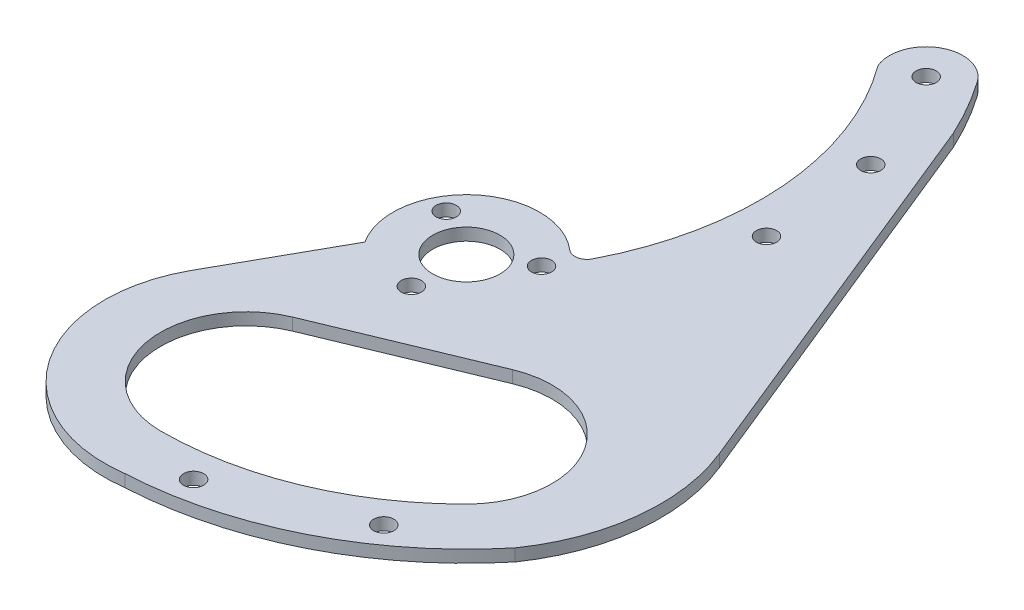
ISO-10303-21;
HEADER;
FILE_DESCRIPTION(('STEP AP214'),'2;1');
FILE_NAME('part.step','',(''),(''),'','','');
FILE_SCHEMA(('AUTOMOTIVE_DESIGN { 1 0 10303 214 1 1 1 1 }'));
ENDSEC;
DATA;
#1=APPLICATION_CONTEXT('core data for automotive mechanical design processes');
#2=APPLICATION_PROTOCOL_DEFINITION('international standard','automotive_design',2000,#1);
#3=PRODUCT_CONTEXT('',#1,'mechanical');
#4=PRODUCT('Part','Part','',(#3));
#5=PRODUCT_RELATED_PRODUCT_CATEGORY('part','',(#4));
#6=PRODUCT_DEFINITION_FORMATION('','',#4);
#7=PRODUCT_DEFINITION_CONTEXT('part definition',#1,'design');
#8=PRODUCT_DEFINITION('design','',#6,#7);
#9=PRODUCT_DEFINITION_SHAPE('','',#8);
#10=(LENGTH_UNIT() NAMED_UNIT(*) SI_UNIT(.MILLI.,.METRE.));
#11=(NAMED_UNIT(*) PLANE_ANGLE_UNIT() SI_UNIT($,.RADIAN.));
#12=(NAMED_UNIT(*) SI_UNIT($,.STERADIAN.) SOLID_ANGLE_UNIT());
#13=UNCERTAINTY_MEASURE_WITH_UNIT(LENGTH_MEASURE(1.E-05),#10,'distance_accuracy_value','');
#14=(GEOMETRIC_REPRESENTATION_CONTEXT(3) GLOBAL_UNCERTAINTY_ASSIGNED_CONTEXT((#13)) GLOBAL_UNIT_ASSIGNED_CONTEXT((#10,
#11,#12)) REPRESENTATION_CONTEXT('',''));
#15=CARTESIAN_POINT('',(0.,0.,0.));
#16=DIRECTION('',(0.,0.,1.));
#17=DIRECTION('',(1.,0.,0.));
#18=AXIS2_PLACEMENT_3D('',#15,#16,#17);
#19=CARTESIAN_POINT('',(0.,2.,36.));
#20=DIRECTION('',(0.,-1.,0.));
#21=DIRECTION('',(0.,0.,-1.));
#22=AXIS2_PLACEMENT_3D('',#19,#20,#21);
#23=PLANE('',#22);
#24=CARTESIAN_POINT('',(12.4144052382108,2.,-62.7929327163513));
#25=DIRECTION('',(0.,-1.,0.));
#26=DIRECTION('',(0.,0.,-1.));
#27=AXIS2_PLACEMENT_3D('',#24,#25,#26);
#28=CIRCLE('',#27,1.65000000000008);
#29=CARTESIAN_POINT('',(12.4144052382108,2.,-64.4429327163514));
#30=VERTEX_POINT('',#29);
#31=EDGE_CURVE('E535',#30,#30,#28,.T.);
#32=ORIENTED_EDGE('',*,*,#31,.T.);
#33=EDGE_LOOP('',(#32));
#34=FACE_BOUND('',#33,.T.);
#35=CARTESIAN_POINT('',(20.340189466215,2.,-45.7960335889309));
#36=DIRECTION('',(0.,-1.,0.));
#37=DIRECTION('',(0.,0.,-1.));
#38=AXIS2_PLACEMENT_3D('',#35,#36,#37);
#39=CIRCLE('',#38,1.64999999999996);
#40=CARTESIAN_POINT('',(20.340189466215,2.,-47.4460335889308));
#41=VERTEX_POINT('',#40);
#42=EDGE_CURVE('E518',#41,#41,#39,.T.);
#43=ORIENTED_EDGE('',*,*,#42,.T.);
#44=EDGE_LOOP('',(#43));
#45=FACE_BOUND('',#44,.T.);
#46=CARTESIAN_POINT('',(21.9747085435597,2.,-27.1133950450212));
#47=DIRECTION('',(0.,-1.,0.));
#48=DIRECTION('',(0.,0.,-1.));
#49=AXIS2_PLACEMENT_3D('',#46,#47,#48);
#50=CIRCLE('',#49,1.65);
#51=CARTESIAN_POINT('',(21.9747085435597,2.,-28.7633950450212));
#52=VERTEX_POINT('',#51);
#53=EDGE_CURVE('E528',#52,#52,#50,.T.);
#54=ORIENTED_EDGE('',*,*,#53,.T.);
#55=EDGE_LOOP('',(#54));
#56=FACE_BOUND('',#55,.T.);
#57=CARTESIAN_POINT('',(31.5467039993079,2.,45.0533624358943));
#58=DIRECTION('',(0.,1.,0.));
#59=DIRECTION('',(0.,0.,-1.));
#60=AXIS2_PLACEMENT_3D('',#57,#58,#59);
#61=CIRCLE('',#60,1.65);
#62=CARTESIAN_POINT('',(31.5467039993079,2.,43.4033624358943));
#63=VERTEX_POINT('',#62);
#64=EDGE_CURVE('E183',#63,#63,#61,.T.);
#65=ORIENTED_EDGE('',*,*,#64,.F.);
#66=EDGE_LOOP('',(#65));
#67=FACE_BOUND('',#66,.T.);
#68=CARTESIAN_POINT('',(9.55064977168081,2.,54.1644264156715));
#69=DIRECTION('',(0.,1.,0.));
#70=DIRECTION('',(0.,0.,1.));
#71=AXIS2_PLACEMENT_3D('',#68,#69,#70);
#72=CIRCLE('',#71,1.65);
#73=CARTESIAN_POINT('',(9.55064977168081,2.,55.8144264156715));
#74=VERTEX_POINT('',#73);
#75=EDGE_CURVE('E189',#74,#74,#72,.T.);
#76=ORIENTED_EDGE('',*,*,#75,.F.);
#77=EDGE_LOOP('',(#76));
#78=FACE_BOUND('',#77,.T.);
#79=CARTESIAN_POINT('',(0.,2.,36.));
#80=DIRECTION('',(0.,1.,0.));
#81=DIRECTION('',(0.,0.,-1.));
#82=AXIS2_PLACEMENT_3D('',#79,#80,#81);
#83=CIRCLE('',#82,23.1609706583571);
#84=CARTESIAN_POINT('',(-20.2182093825748,2.,24.7015677547882));
#85=VERTEX_POINT('',#84);
#86=CARTESIAN_POINT('',(3.14209602281216,2.,58.9468471564332));
#87=VERTEX_POINT('',#86);
#88=EDGE_CURVE('E195',#85,#87,#83,.T.);
#89=ORIENTED_EDGE('',*,*,#88,.T.);
#90=CARTESIAN_POINT('',(0.,2.,0.));
#91=DIRECTION('',(0.,1.,0.));
#92=DIRECTION('',(0.,0.,-1.));
#93=AXIS2_PLACEMENT_3D('',#90,#91,#92);
#94=CIRCLE('',#93,59.0305307201322);
#95=CARTESIAN_POINT('',(45.5387285465792,2.,37.5609872003045));
#96=VERTEX_POINT('',#95);
#97=EDGE_CURVE('E198',#87,#96,#94,.T.);
#98=ORIENTED_EDGE('',*,*,#97,.T.);
#99=CARTESIAN_POINT('',(19.4454364826301,2.,19.44543648263));
#100=DIRECTION('',(0.,1.,0.));
#101=DIRECTION('',(0.,0.,1.));
#102=AXIS2_PLACEMENT_3D('',#99,#100,#101);
#103=CIRCLE('',#102,31.7652808666819);
#104=CARTESIAN_POINT('',(48.8691137032386,2.,7.47546207344154));
#105=VERTEX_POINT('',#104);
#106=EDGE_CURVE('E201',#96,#105,#103,.T.);
#107=ORIENTED_EDGE('',*,*,#106,.T.);
#108=DIRECTION('',(-0.376825706639465,0.,-0.926284182535612));
#109=VECTOR('',#108,1.);
#110=CARTESIAN_POINT('',(22.6305813504651,2.,-57.022094921991));
#111=LINE('',#110,#109);
#112=CARTESIAN_POINT('',(22.6305813504651,2.,-57.022094921991));
#113=VERTEX_POINT('',#112);
#114=EDGE_CURVE('E203',#105,#113,#111,.T.);
#115=ORIENTED_EDGE('',*,*,#114,.T.);
#116=CARTESIAN_POINT('',(-31.8198051533946,2.,-31.8198051533947));
#117=DIRECTION('',(0.,1.,0.));
#118=DIRECTION('',(0.,0.,-1.));
#119=AXIS2_PLACEMENT_3D('',#116,#117,#118);
#120=CIRCLE('',#119,60.);
#121=CARTESIAN_POINT('',(17.3293175039448,2.,-66.2343913344576));
#122=VERTEX_POINT('',#121);
#123=EDGE_CURVE('E205',#113,#122,#120,.T.);
#124=ORIENTED_EDGE('',*,*,#123,.T.);
#125=CARTESIAN_POINT('',(12.4144052382108,2.,-62.7929327163513));
#126=DIRECTION('',(0.,1.,0.));
#127=DIRECTION('',(0.,0.,1.));
#128=AXIS2_PLACEMENT_3D('',#125,#126,#127);
#129=CIRCLE('',#128,6.00000000000001);
#130=CARTESIAN_POINT('',(6.90727906521997,2.,-60.4114287136759));
#131=VERTEX_POINT('',#130);
#132=EDGE_CURVE('E207',#122,#131,#129,.T.);
#133=ORIENTED_EDGE('',*,*,#132,.T.);
#134=CARTESIAN_POINT('',(-31.8198051533946,2.,-31.8198051533947));
#135=DIRECTION('',(0.,-1.,0.));
#136=DIRECTION('',(0.,0.,-1.));
#137=AXIS2_PLACEMENT_3D('',#134,#135,#136);
#138=CIRCLE('',#137,48.138009824758);
#139=CARTESIAN_POINT('',(10.9237300160148,2.,-9.67803035754882));
#140=VERTEX_POINT('',#139);
#141=EDGE_CURVE('E209',#131,#140,#138,.T.);
#142=ORIENTED_EDGE('',*,*,#141,.T.);
#143=CARTESIAN_POINT('',(9.1478553870049,2.,-10.5979593233059));
#144=DIRECTION('',(0.,-1.,0.));
#145=DIRECTION('',(0.,0.,-1.));
#146=AXIS2_PLACEMENT_3D('',#143,#144,#145);
#147=CIRCLE('',#146,2.);
#148=CARTESIAN_POINT('',(7.84101890314706,2.,-9.08396513426216));
#149=VERTEX_POINT('',#148);
#150=EDGE_CURVE('E11',#140,#149,#147,.T.);
#151=ORIENTED_EDGE('',*,*,#150,.T.);
#152=CARTESIAN_POINT('',(0.,2.,0.));
#153=DIRECTION('',(0.,1.,0.));
#154=DIRECTION('',(0.,0.,1.));
#155=AXIS2_PLACEMENT_3D('',#152,#153,#154);
#156=CIRCLE('',#155,12.);
#157=CARTESIAN_POINT('',(-10.0654503660491,2.,6.53350663339386));
#158=VERTEX_POINT('',#157);
#159=EDGE_CURVE('E211',#149,#158,#156,.T.);
#160=ORIENTED_EDGE('',*,*,#159,.T.);
#161=DIRECTION('',(-0.487822052532803,0.,0.872943093828391));
#162=VECTOR('',#161,1.);
#163=CARTESIAN_POINT('',(-10.0654503660491,2.,6.53350663339385));
#164=LINE('',#163,#162);
#165=EDGE_CURVE('E213',#158,#85,#164,.T.);
#166=ORIENTED_EDGE('',*,*,#165,.T.);
#167=EDGE_LOOP('',(#89,#98,#107,#115,#124,#133,#142,#151,#160,#166));
#168=FACE_BOUND('',#167,.T.);
#169=CARTESIAN_POINT('',(0.,2.,36.));
#170=DIRECTION('',(0.,1.,0.));
#171=DIRECTION('',(0.,0.,-1.));
#172=AXIS2_PLACEMENT_3D('',#169,#170,#171);
#173=CIRCLE('',#172,14.);
#174=CARTESIAN_POINT('',(-5.35756805311127,2.,23.065686544842));
#175=VERTEX_POINT('',#174);
#176=CARTESIAN_POINT('',(0.,2.,50.));
#177=VERTEX_POINT('',#176);
#178=EDGE_CURVE('E139',#175,#177,#173,.T.);
#179=ORIENTED_EDGE('',*,*,#178,.F.);
#180=DIRECTION('',(-0.923879532511287,0.,0.38268343236509));
#181=VECTOR('',#180,1.);
#182=CARTESIAN_POINT('',(-5.35756805311127,2.,23.065686544842));
#183=LINE('',#182,#181);
#184=CARTESIAN_POINT('',(20.0982760696045,2.,12.5215306675577));
#185=VERTEX_POINT('',#184);
#186=EDGE_CURVE('E165',#185,#175,#183,.T.);
#187=ORIENTED_EDGE('',*,*,#186,.F.);
#188=CARTESIAN_POINT('',(25.4558441227158,2.,25.4558441227157));
#189=DIRECTION('',(0.,1.,0.));
#190=DIRECTION('',(0.,0.,1.));
#191=AXIS2_PLACEMENT_3D('',#188,#189,#190);
#192=CIRCLE('',#191,14.);
#193=CARTESIAN_POINT('',(35.3553390593274,2.,35.3553390593273));
#194=VERTEX_POINT('',#193);
#195=EDGE_CURVE('E163',#194,#185,#192,.T.);
#196=ORIENTED_EDGE('',*,*,#195,.F.);
#197=CARTESIAN_POINT('',(0.,2.,0.));
#198=DIRECTION('',(0.,1.,0.));
#199=DIRECTION('',(0.,0.,1.));
#200=AXIS2_PLACEMENT_3D('',#197,#198,#199);
#201=CIRCLE('',#200,50.);
#202=EDGE_CURVE('E149',#177,#194,#201,.T.);
#203=ORIENTED_EDGE('',*,*,#202,.F.);
#204=EDGE_LOOP('',(#179,#187,#196,#203));
#205=FACE_BOUND('',#204,.T.);
#206=CARTESIAN_POINT('',(0.,2.,0.));
#207=DIRECTION('',(0.,1.,0.));
#208=DIRECTION('',(0.,0.,1.));
#209=AXIS2_PLACEMENT_3D('',#206,#207,#208);
#210=CIRCLE('',#209,5.5);
#211=CARTESIAN_POINT('',(0.,2.,5.5));
#212=VERTEX_POINT('',#211);
#213=EDGE_CURVE('E172',#212,#212,#210,.T.);
#214=ORIENTED_EDGE('',*,*,#213,.F.);
#215=EDGE_LOOP('',(#214));
#216=FACE_BOUND('',#215,.T.);
#217=CARTESIAN_POINT('',(0.,2.,9.));
#218=DIRECTION('',(0.,1.,0.));
#219=DIRECTION('',(0.,0.,1.));
#220=AXIS2_PLACEMENT_3D('',#217,#218,#219);
#221=CIRCLE('',#220,1.65);
#222=CARTESIAN_POINT('',(0.,2.,10.65));
#223=VERTEX_POINT('',#222);
#224=EDGE_CURVE('E548',#223,#223,#221,.T.);
#225=ORIENTED_EDGE('',*,*,#224,.F.);
#226=EDGE_LOOP('',(#225));
#227=FACE_BOUND('',#226,.T.);
#228=CARTESIAN_POINT('',(-7.79422863405993,2.,-4.50000000000003));
#229=DIRECTION('',(0.,1.,0.));
#230=DIRECTION('',(0.,0.,1.));
#231=AXIS2_PLACEMENT_3D('',#228,#229,#230);
#232=CIRCLE('',#231,1.65);
#233=CARTESIAN_POINT('',(-7.79422863405993,2.,-2.85000000000003));
#234=VERTEX_POINT('',#233);
#235=EDGE_CURVE('E542',#234,#234,#232,.T.);
#236=ORIENTED_EDGE('',*,*,#235,.F.);
#237=EDGE_LOOP('',(#236));
#238=FACE_BOUND('',#237,.T.);
#239=CARTESIAN_POINT('',(7.79422863405999,2.,-4.49999999999993));
#240=DIRECTION('',(0.,1.,0.));
#241=DIRECTION('',(0.,0.,1.));
#242=AXIS2_PLACEMENT_3D('',#239,#240,#241);
#243=CIRCLE('',#242,1.65);
#244=CARTESIAN_POINT('',(7.79422863405999,2.,-2.84999999999993));
#245=VERTEX_POINT('',#244);
#246=EDGE_CURVE('E536',#245,#245,#243,.T.);
#247=ORIENTED_EDGE('',*,*,#246,.F.);
#248=EDGE_LOOP('',(#247));
#249=FACE_BOUND('',#248,.T.);
#250=ADVANCED_FACE('F37',(#34,#45,#56,#67,#78,#168,#205,#216,#227,#238,#249),#23,.F.);
#251=CARTESIAN_POINT('',(0.,0.,36.));
#252=DIRECTION('',(0.,-1.,0.));
#253=DIRECTION('',(0.,0.,-1.));
#254=AXIS2_PLACEMENT_3D('',#251,#252,#253);
#255=PLANE('',#254);
#256=CARTESIAN_POINT('',(12.4144052382108,0.,-62.7929327163513));
#257=DIRECTION('',(0.,-1.,0.));
#258=DIRECTION('',(0.,0.,-1.));
#259=AXIS2_PLACEMENT_3D('',#256,#257,#258);
#260=CIRCLE('',#259,1.65000000000008);
#261=CARTESIAN_POINT('',(12.4144052382108,0.,-64.4429327163514));
#262=VERTEX_POINT('',#261);
#263=EDGE_CURVE('E524',#262,#262,#260,.T.);
#264=ORIENTED_EDGE('',*,*,#263,.F.);
#265=EDGE_LOOP('',(#264));
#266=FACE_BOUND('',#265,.T.);
#267=CARTESIAN_POINT('',(20.340189466215,0.,-45.7960335889309));
#268=DIRECTION('',(0.,-1.,0.));
#269=DIRECTION('',(0.,0.,-1.));
#270=AXIS2_PLACEMENT_3D('',#267,#268,#269);
#271=CIRCLE('',#270,1.64999999999996);
#272=CARTESIAN_POINT('',(20.340189466215,0.,-47.4460335889308));
#273=VERTEX_POINT('',#272);
#274=EDGE_CURVE('E521',#273,#273,#271,.T.);
#275=ORIENTED_EDGE('',*,*,#274,.F.);
#276=EDGE_LOOP('',(#275));
#277=FACE_BOUND('',#276,.T.);
#278=CARTESIAN_POINT('',(21.9747085435597,0.,-27.1133950450212));
#279=DIRECTION('',(0.,-1.,0.));
#280=DIRECTION('',(0.,0.,-1.));
#281=AXIS2_PLACEMENT_3D('',#278,#279,#280);
#282=CIRCLE('',#281,1.65);
#283=CARTESIAN_POINT('',(21.9747085435597,0.,-28.7633950450212));
#284=VERTEX_POINT('',#283);
#285=EDGE_CURVE('E532',#284,#284,#282,.T.);
#286=ORIENTED_EDGE('',*,*,#285,.F.);
#287=EDGE_LOOP('',(#286));
#288=FACE_BOUND('',#287,.T.);
#289=CARTESIAN_POINT('',(-7.79422863405993,0.,-4.50000000000003));
#290=DIRECTION('',(0.,1.,0.));
#291=DIRECTION('',(0.,0.,1.));
#292=AXIS2_PLACEMENT_3D('',#289,#290,#291);
#293=CIRCLE('',#292,1.65);
#294=CARTESIAN_POINT('',(-7.79422863405993,0.,-2.85000000000003));
#295=VERTEX_POINT('',#294);
#296=EDGE_CURVE('E539',#295,#295,#293,.T.);
#297=ORIENTED_EDGE('',*,*,#296,.T.);
#298=EDGE_LOOP('',(#297));
#299=FACE_BOUND('',#298,.T.);
#300=CARTESIAN_POINT('',(0.,0.,0.));
#301=DIRECTION('',(0.,1.,0.));
#302=DIRECTION('',(0.,0.,1.));
#303=AXIS2_PLACEMENT_3D('',#300,#301,#302);
#304=CIRCLE('',#303,5.5);
#305=CARTESIAN_POINT('',(0.,0.,5.5));
#306=VERTEX_POINT('',#305);
#307=EDGE_CURVE('E551',#306,#306,#304,.T.);
#308=ORIENTED_EDGE('',*,*,#307,.T.);
#309=EDGE_LOOP('',(#308));
#310=FACE_BOUND('',#309,.T.);
#311=CARTESIAN_POINT('',(9.55064977168081,0.,54.1644264156715));
#312=DIRECTION('',(0.,1.,0.));
#313=DIRECTION('',(0.,0.,1.));
#314=AXIS2_PLACEMENT_3D('',#311,#312,#313);
#315=CIRCLE('',#314,1.65);
#316=CARTESIAN_POINT('',(9.55064977168081,0.,55.8144264156715));
#317=VERTEX_POINT('',#316);
#318=EDGE_CURVE('E186',#317,#317,#315,.T.);
#319=ORIENTED_EDGE('',*,*,#318,.T.);
#320=EDGE_LOOP('',(#319));
#321=FACE_BOUND('',#320,.T.);
#322=CARTESIAN_POINT('',(0.,0.,36.));
#323=DIRECTION('',(0.,1.,0.));
#324=DIRECTION('',(0.,0.,-1.));
#325=AXIS2_PLACEMENT_3D('',#322,#323,#324);
#326=CIRCLE('',#325,23.1609706583571);
#327=CARTESIAN_POINT('',(-20.2182093825748,0.,24.7015677547882));
#328=VERTEX_POINT('',#327);
#329=CARTESIAN_POINT('',(3.14209602281216,0.,58.9468471564332));
#330=VERTEX_POINT('',#329);
#331=EDGE_CURVE('E192',#328,#330,#326,.T.);
#332=ORIENTED_EDGE('',*,*,#331,.F.);
#333=DIRECTION('',(-0.487822052532803,0.,0.872943093828391));
#334=VECTOR('',#333,1.);
#335=CARTESIAN_POINT('',(-10.0654503660491,0.,6.53350663339385));
#336=LINE('',#335,#334);
#337=CARTESIAN_POINT('',(-10.0654503660491,0.,6.53350663339386));
#338=VERTEX_POINT('',#337);
#339=EDGE_CURVE('E199',#338,#328,#336,.T.);
#340=ORIENTED_EDGE('',*,*,#339,.F.);
#341=CARTESIAN_POINT('',(0.,0.,0.));
#342=DIRECTION('',(0.,1.,0.));
#343=DIRECTION('',(0.,0.,1.));
#344=AXIS2_PLACEMENT_3D('',#341,#342,#343);
#345=CIRCLE('',#344,12.);
#346=CARTESIAN_POINT('',(7.84101890314706,0.,-9.08396513426216));
#347=VERTEX_POINT('',#346);
#348=EDGE_CURVE('E230',#347,#338,#345,.T.);
#349=ORIENTED_EDGE('',*,*,#348,.F.);
#350=CARTESIAN_POINT('',(9.1478553870049,0.,-10.5979593233059));
#351=DIRECTION('',(0.,-1.,0.));
#352=DIRECTION('',(0.,0.,-1.));
#353=AXIS2_PLACEMENT_3D('',#350,#351,#352);
#354=CIRCLE('',#353,2.);
#355=CARTESIAN_POINT('',(10.9237300160148,0.,-9.67803035754882));
#356=VERTEX_POINT('',#355);
#357=EDGE_CURVE('E45',#347,#356,#354,.F.);
#358=ORIENTED_EDGE('',*,*,#357,.T.);
#359=CARTESIAN_POINT('',(-31.8198051533946,0.,-31.8198051533947));
#360=DIRECTION('',(0.,-1.,0.));
#361=DIRECTION('',(0.,0.,-1.));
#362=AXIS2_PLACEMENT_3D('',#359,#360,#361);
#363=CIRCLE('',#362,48.138009824758);
#364=CARTESIAN_POINT('',(6.90727906521997,0.,-60.4114287136759));
#365=VERTEX_POINT('',#364);
#366=EDGE_CURVE('E228',#365,#356,#363,.T.);
#367=ORIENTED_EDGE('',*,*,#366,.F.);
#368=CARTESIAN_POINT('',(12.4144052382108,0.,-62.7929327163513));
#369=DIRECTION('',(0.,1.,0.));
#370=DIRECTION('',(0.,0.,1.));
#371=AXIS2_PLACEMENT_3D('',#368,#369,#370);
#372=CIRCLE('',#371,6.00000000000001);
#373=CARTESIAN_POINT('',(17.3293175039448,0.,-66.2343913344576));
#374=VERTEX_POINT('',#373);
#375=EDGE_CURVE('E226',#374,#365,#372,.T.);
#376=ORIENTED_EDGE('',*,*,#375,.F.);
#377=CARTESIAN_POINT('',(-31.8198051533946,0.,-31.8198051533947));
#378=DIRECTION('',(0.,1.,0.));
#379=DIRECTION('',(0.,0.,-1.));
#380=AXIS2_PLACEMENT_3D('',#377,#378,#379);
#381=CIRCLE('',#380,60.);
#382=CARTESIAN_POINT('',(22.6305813504651,0.,-57.022094921991));
#383=VERTEX_POINT('',#382);
#384=EDGE_CURVE('E224',#383,#374,#381,.T.);
#385=ORIENTED_EDGE('',*,*,#384,.F.);
#386=DIRECTION('',(-0.376825706639465,0.,-0.926284182535612));
#387=VECTOR('',#386,1.);
#388=CARTESIAN_POINT('',(22.6305813504651,0.,-57.022094921991));
#389=LINE('',#388,#387);
#390=CARTESIAN_POINT('',(48.8691137032386,0.,7.47546207344154));
#391=VERTEX_POINT('',#390);
#392=EDGE_CURVE('E222',#391,#383,#389,.T.);
#393=ORIENTED_EDGE('',*,*,#392,.F.);
#394=CARTESIAN_POINT('',(19.4454364826301,0.,19.44543648263));
#395=DIRECTION('',(0.,1.,0.));
#396=DIRECTION('',(0.,0.,1.));
#397=AXIS2_PLACEMENT_3D('',#394,#395,#396);
#398=CIRCLE('',#397,31.7652808666819);
#399=CARTESIAN_POINT('',(45.5387285465792,0.,37.5609872003045));
#400=VERTEX_POINT('',#399);
#401=EDGE_CURVE('E220',#400,#391,#398,.T.);
#402=ORIENTED_EDGE('',*,*,#401,.F.);
#403=CARTESIAN_POINT('',(0.,0.,0.));
#404=DIRECTION('',(0.,1.,0.));
#405=DIRECTION('',(0.,0.,-1.));
#406=AXIS2_PLACEMENT_3D('',#403,#404,#405);
#407=CIRCLE('',#406,59.0305307201322);
#408=EDGE_CURVE('E218',#330,#400,#407,.T.);
#409=ORIENTED_EDGE('',*,*,#408,.F.);
#410=EDGE_LOOP('',(#332,#340,#349,#358,#367,#376,#385,#393,#402,#409));
#411=FACE_BOUND('',#410,.T.);
#412=CARTESIAN_POINT('',(31.5467039993079,0.,45.0533624358943));
#413=DIRECTION('',(0.,1.,0.));
#414=DIRECTION('',(0.,0.,-1.));
#415=AXIS2_PLACEMENT_3D('',#412,#413,#414);
#416=CIRCLE('',#415,1.65);
#417=CARTESIAN_POINT('',(31.5467039993079,0.,43.4033624358943));
#418=VERTEX_POINT('',#417);
#419=EDGE_CURVE('E157',#418,#418,#416,.T.);
#420=ORIENTED_EDGE('',*,*,#419,.T.);
#421=EDGE_LOOP('',(#420));
#422=FACE_BOUND('',#421,.T.);
#423=DIRECTION('',(-0.923879532511287,0.,0.38268343236509));
#424=VECTOR('',#423,1.);
#425=CARTESIAN_POINT('',(-5.35756805311127,0.,23.065686544842));
#426=LINE('',#425,#424);
#427=CARTESIAN_POINT('',(20.0982760696045,0.,12.5215306675577));
#428=VERTEX_POINT('',#427);
#429=CARTESIAN_POINT('',(-5.35756805311127,0.,23.065686544842));
#430=VERTEX_POINT('',#429);
#431=EDGE_CURVE('E150',#428,#430,#426,.T.);
#432=ORIENTED_EDGE('',*,*,#431,.T.);
#433=CARTESIAN_POINT('',(0.,0.,36.));
#434=DIRECTION('',(0.,1.,0.));
#435=DIRECTION('',(0.,0.,-1.));
#436=AXIS2_PLACEMENT_3D('',#433,#434,#435);
#437=CIRCLE('',#436,14.);
#438=CARTESIAN_POINT('',(0.,0.,50.));
#439=VERTEX_POINT('',#438);
#440=EDGE_CURVE('E170',#430,#439,#437,.T.);
#441=ORIENTED_EDGE('',*,*,#440,.T.);
#442=CARTESIAN_POINT('',(0.,0.,0.));
#443=DIRECTION('',(0.,1.,0.));
#444=DIRECTION('',(0.,0.,1.));
#445=AXIS2_PLACEMENT_3D('',#442,#443,#444);
#446=CIRCLE('',#445,50.);
#447=CARTESIAN_POINT('',(35.3553390593274,0.,35.3553390593273));
#448=VERTEX_POINT('',#447);
#449=EDGE_CURVE('E156',#439,#448,#446,.T.);
#450=ORIENTED_EDGE('',*,*,#449,.T.);
#451=CARTESIAN_POINT('',(25.4558441227158,0.,25.4558441227157));
#452=DIRECTION('',(0.,1.,0.));
#453=DIRECTION('',(0.,0.,1.));
#454=AXIS2_PLACEMENT_3D('',#451,#452,#453);
#455=CIRCLE('',#454,14.);
#456=EDGE_CURVE('E174',#448,#428,#455,.T.);
#457=ORIENTED_EDGE('',*,*,#456,.T.);
#458=EDGE_LOOP('',(#432,#441,#450,#457));
#459=FACE_BOUND('',#458,.T.);
#460=CARTESIAN_POINT('',(0.,0.,9.));
#461=DIRECTION('',(0.,1.,0.));
#462=DIRECTION('',(0.,0.,1.));
#463=AXIS2_PLACEMENT_3D('',#460,#461,#462);
#464=CIRCLE('',#463,1.65);
#465=CARTESIAN_POINT('',(0.,0.,10.65));
#466=VERTEX_POINT('',#465);
#467=EDGE_CURVE('E545',#466,#466,#464,.T.);
#468=ORIENTED_EDGE('',*,*,#467,.T.);
#469=EDGE_LOOP('',(#468));
#470=FACE_BOUND('',#469,.T.);
#471=CARTESIAN_POINT('',(7.79422863405999,0.,-4.49999999999993));
#472=DIRECTION('',(0.,1.,0.));
#473=DIRECTION('',(0.,0.,1.));
#474=AXIS2_PLACEMENT_3D('',#471,#472,#473);
#475=CIRCLE('',#474,1.65);
#476=CARTESIAN_POINT('',(7.79422863405999,0.,-2.84999999999993));
#477=VERTEX_POINT('',#476);
#478=EDGE_CURVE('E531',#477,#477,#475,.T.);
#479=ORIENTED_EDGE('',*,*,#478,.T.);
#480=EDGE_LOOP('',(#479));
#481=FACE_BOUND('',#480,.T.);
#482=ADVANCED_FACE('F268',(#266,#277,#288,#299,#310,#321,#411,#422,#459,#470,#481),#255,.T.);
#483=CARTESIAN_POINT('',(0.,2.,36.));
#484=DIRECTION('',(0.,-1.,0.));
#485=DIRECTION('',(0.,0.,-1.));
#486=AXIS2_PLACEMENT_3D('',#483,#484,#485);
#487=CYLINDRICAL_SURFACE('',#486,23.1609706583571);
#488=ORIENTED_EDGE('',*,*,#331,.T.);
#489=DIRECTION('',(0.,-1.,0.));
#490=VECTOR('',#489,1.);
#491=CARTESIAN_POINT('',(3.14209602281216,2.,58.9468471564332));
#492=LINE('',#491,#490);
#493=EDGE_CURVE('E253',#87,#330,#492,.T.);
#494=ORIENTED_EDGE('',*,*,#493,.F.);
#495=ORIENTED_EDGE('',*,*,#88,.F.);
#496=DIRECTION('',(0.,-1.,0.));
#497=VECTOR('',#496,1.);
#498=CARTESIAN_POINT('',(-20.2182093825748,2.,24.7015677547882));
#499=LINE('',#498,#497);
#500=EDGE_CURVE('E215',#85,#328,#499,.T.);
#501=ORIENTED_EDGE('',*,*,#500,.T.);
#502=EDGE_LOOP('',(#488,#494,#495,#501));
#503=FACE_BOUND('',#502,.T.);
#504=ADVANCED_FACE('F276',(#503),#487,.T.);
#505=CARTESIAN_POINT('',(0.,2.,0.));
#506=DIRECTION('',(0.,-1.,0.));
#507=DIRECTION('',(0.,0.,-1.));
#508=AXIS2_PLACEMENT_3D('',#505,#506,#507);
#509=CYLINDRICAL_SURFACE('',#508,59.0305307201322);
#510=ORIENTED_EDGE('',*,*,#408,.T.);
#511=DIRECTION('',(0.,-1.,0.));
#512=VECTOR('',#511,1.);
#513=CARTESIAN_POINT('',(45.5387285465792,2.,37.5609872003045));
#514=LINE('',#513,#512);
#515=EDGE_CURVE('E250',#96,#400,#514,.T.);
#516=ORIENTED_EDGE('',*,*,#515,.F.);
#517=ORIENTED_EDGE('',*,*,#97,.F.);
#518=ORIENTED_EDGE('',*,*,#493,.T.);
#519=EDGE_LOOP('',(#510,#516,#517,#518));
#520=FACE_BOUND('',#519,.T.);
#521=ADVANCED_FACE('F324',(#520),#509,.T.);
#522=CARTESIAN_POINT('',(19.4454364826301,2.,19.44543648263));
#523=DIRECTION('',(0.,-1.,0.));
#524=DIRECTION('',(0.,0.,-1.));
#525=AXIS2_PLACEMENT_3D('',#522,#523,#524);
#526=CYLINDRICAL_SURFACE('',#525,31.7652808666819);
#527=ORIENTED_EDGE('',*,*,#401,.T.);
#528=DIRECTION('',(0.,-1.,0.));
#529=VECTOR('',#528,1.);
#530=CARTESIAN_POINT('',(48.8691137032386,2.,7.47546207344154));
#531=LINE('',#530,#529);
#532=EDGE_CURVE('E247',#105,#391,#531,.T.);
#533=ORIENTED_EDGE('',*,*,#532,.F.);
#534=ORIENTED_EDGE('',*,*,#106,.F.);
#535=ORIENTED_EDGE('',*,*,#515,.T.);
#536=EDGE_LOOP('',(#527,#533,#534,#535));
#537=FACE_BOUND('',#536,.T.);
#538=ADVANCED_FACE('F320',(#537),#526,.T.);
#539=CARTESIAN_POINT('',(22.6305813504651,2.,-57.022094921991));
#540=DIRECTION('',(-0.926284182535612,0.,0.376825706639465));
#541=DIRECTION('',(0.376825706639465,0.,0.926284182535612));
#542=AXIS2_PLACEMENT_3D('',#539,#540,#541);
#543=PLANE('',#542);
#544=ORIENTED_EDGE('',*,*,#392,.T.);
#545=DIRECTION('',(0.,-1.,0.));
#546=VECTOR('',#545,1.);
#547=CARTESIAN_POINT('',(22.6305813504651,2.,-57.022094921991));
#548=LINE('',#547,#546);
#549=EDGE_CURVE('E244',#113,#383,#548,.T.);
#550=ORIENTED_EDGE('',*,*,#549,.F.);
#551=ORIENTED_EDGE('',*,*,#114,.F.);
#552=ORIENTED_EDGE('',*,*,#532,.T.);
#553=EDGE_LOOP('',(#544,#550,#551,#552));
#554=FACE_BOUND('',#553,.T.);
#555=ADVANCED_FACE('F316',(#554),#543,.F.);
#556=CARTESIAN_POINT('',(-31.8198051533946,2.,-31.8198051533947));
#557=DIRECTION('',(0.,-1.,0.));
#558=DIRECTION('',(0.,0.,-1.));
#559=AXIS2_PLACEMENT_3D('',#556,#557,#558);
#560=CYLINDRICAL_SURFACE('',#559,60.);
#561=ORIENTED_EDGE('',*,*,#384,.T.);
#562=DIRECTION('',(0.,-1.,0.));
#563=VECTOR('',#562,1.);
#564=CARTESIAN_POINT('',(17.3293175039448,2.,-66.2343913344576));
#565=LINE('',#564,#563);
#566=EDGE_CURVE('E241',#122,#374,#565,.T.);
#567=ORIENTED_EDGE('',*,*,#566,.F.);
#568=ORIENTED_EDGE('',*,*,#123,.F.);
#569=ORIENTED_EDGE('',*,*,#549,.T.);
#570=EDGE_LOOP('',(#561,#567,#568,#569));
#571=FACE_BOUND('',#570,.T.);
#572=ADVANCED_FACE('F312',(#571),#560,.T.);
#573=CARTESIAN_POINT('',(12.4144052382108,2.,-62.7929327163513));
#574=DIRECTION('',(0.,-1.,0.));
#575=DIRECTION('',(0.,0.,-1.));
#576=AXIS2_PLACEMENT_3D('',#573,#574,#575);
#577=CYLINDRICAL_SURFACE('',#576,6.00000000000001);
#578=ORIENTED_EDGE('',*,*,#375,.T.);
#579=DIRECTION('',(0.,-1.,0.));
#580=VECTOR('',#579,1.);
#581=CARTESIAN_POINT('',(6.90727906521997,2.,-60.4114287136759));
#582=LINE('',#581,#580);
#583=EDGE_CURVE('E238',#131,#365,#582,.T.);
#584=ORIENTED_EDGE('',*,*,#583,.F.);
#585=ORIENTED_EDGE('',*,*,#132,.F.);
#586=ORIENTED_EDGE('',*,*,#566,.T.);
#587=EDGE_LOOP('',(#578,#584,#585,#586));
#588=FACE_BOUND('',#587,.T.);
#589=ADVANCED_FACE('F309',(#588),#577,.T.);
#590=CARTESIAN_POINT('',(-31.8198051533946,2.,-31.8198051533947));
#591=DIRECTION('',(0.,-1.,0.));
#592=DIRECTION('',(0.,0.,-1.));
#593=AXIS2_PLACEMENT_3D('',#590,#591,#592);
#594=CYLINDRICAL_SURFACE('',#593,48.138009824758);
#595=ORIENTED_EDGE('',*,*,#366,.T.);
#596=DIRECTION('',(0.,-1.,0.));
#597=VECTOR('',#596,1.);
#598=CARTESIAN_POINT('',(10.9237300160148,2.,-9.67803035754882));
#599=LINE('',#598,#597);
#600=EDGE_CURVE('E52',#356,#140,#599,.F.);
#601=ORIENTED_EDGE('',*,*,#600,.T.);
#602=ORIENTED_EDGE('',*,*,#141,.F.);
#603=ORIENTED_EDGE('',*,*,#583,.T.);
#604=EDGE_LOOP('',(#595,#601,#602,#603));
#605=FACE_BOUND('',#604,.T.);
#606=ADVANCED_FACE('F306',(#605),#594,.F.);
#607=CARTESIAN_POINT('',(0.,2.,0.));
#608=DIRECTION('',(0.,-1.,0.));
#609=DIRECTION('',(0.,0.,-1.));
#610=AXIS2_PLACEMENT_3D('',#607,#608,#609);
#611=CYLINDRICAL_SURFACE('',#610,12.);
#612=ORIENTED_EDGE('',*,*,#159,.F.);
#613=DIRECTION('',(0.,-1.,0.));
#614=VECTOR('',#613,1.);
#615=CARTESIAN_POINT('',(7.84101890314706,2.,-9.08396513426216));
#616=LINE('',#615,#614);
#617=EDGE_CURVE('E256',#149,#347,#616,.T.);
#618=ORIENTED_EDGE('',*,*,#617,.T.);
#619=ORIENTED_EDGE('',*,*,#348,.T.);
#620=DIRECTION('',(0.,-1.,0.));
#621=VECTOR('',#620,1.);
#622=CARTESIAN_POINT('',(-10.0654503660491,2.,6.53350663339386));
#623=LINE('',#622,#621);
#624=EDGE_CURVE('E235',#158,#338,#623,.T.);
#625=ORIENTED_EDGE('',*,*,#624,.F.);
#626=EDGE_LOOP('',(#612,#618,#619,#625));
#627=FACE_BOUND('',#626,.T.);
#628=ADVANCED_FACE('F262',(#627),#611,.T.);
#629=CARTESIAN_POINT('',(-10.0654503660491,2.,6.53350663339385));
#630=DIRECTION('',(0.872943093828391,0.,0.487822052532803));
#631=DIRECTION('',(0.487822052532803,0.,-0.872943093828391));
#632=AXIS2_PLACEMENT_3D('',#629,#630,#631);
#633=PLANE('',#632);
#634=ORIENTED_EDGE('',*,*,#339,.T.);
#635=ORIENTED_EDGE('',*,*,#500,.F.);
#636=ORIENTED_EDGE('',*,*,#165,.F.);
#637=ORIENTED_EDGE('',*,*,#624,.T.);
#638=EDGE_LOOP('',(#634,#635,#636,#637));
#639=FACE_BOUND('',#638,.T.);
#640=ADVANCED_FACE('F272',(#639),#633,.F.);
#641=CARTESIAN_POINT('',(9.55064977168081,2.,54.1644264156715));
#642=DIRECTION('',(0.,-1.,0.));
#643=DIRECTION('',(0.,0.,-1.));
#644=AXIS2_PLACEMENT_3D('',#641,#642,#643);
#645=CYLINDRICAL_SURFACE('',#644,1.65);
#646=ORIENTED_EDGE('',*,*,#75,.T.);
#647=EDGE_LOOP('',(#646));
#648=FACE_BOUND('',#647,.T.);
#649=ORIENTED_EDGE('',*,*,#318,.F.);
#650=EDGE_LOOP('',(#649));
#651=FACE_BOUND('',#650,.T.);
#652=ADVANCED_FACE('F299',(#648,#651),#645,.F.);
#653=CARTESIAN_POINT('',(31.5467039993079,2.,45.0533624358943));
#654=DIRECTION('',(0.,-1.,0.));
#655=DIRECTION('',(0.,0.,-1.));
#656=AXIS2_PLACEMENT_3D('',#653,#654,#655);
#657=CYLINDRICAL_SURFACE('',#656,1.65);
#658=ORIENTED_EDGE('',*,*,#64,.T.);
#659=EDGE_LOOP('',(#658));
#660=FACE_BOUND('',#659,.T.);
#661=ORIENTED_EDGE('',*,*,#419,.F.);
#662=EDGE_LOOP('',(#661));
#663=FACE_BOUND('',#662,.T.);
#664=ADVANCED_FACE('F371',(#660,#663),#657,.F.);
#665=CARTESIAN_POINT('',(0.,2.,36.));
#666=DIRECTION('',(0.,-1.,0.));
#667=DIRECTION('',(0.,0.,-1.));
#668=AXIS2_PLACEMENT_3D('',#665,#666,#667);
#669=CYLINDRICAL_SURFACE('',#668,14.);
#670=ORIENTED_EDGE('',*,*,#440,.F.);
#671=DIRECTION('',(0.,-1.,0.));
#672=VECTOR('',#671,1.);
#673=CARTESIAN_POINT('',(-5.35756805311127,2.,23.065686544842));
#674=LINE('',#673,#672);
#675=EDGE_CURVE('E145',#175,#430,#674,.T.);
#676=ORIENTED_EDGE('',*,*,#675,.F.);
#677=ORIENTED_EDGE('',*,*,#178,.T.);
#678=DIRECTION('',(0.,-1.,0.));
#679=VECTOR('',#678,1.);
#680=CARTESIAN_POINT('',(0.,2.,50.));
#681=LINE('',#680,#679);
#682=EDGE_CURVE('E142',#177,#439,#681,.T.);
#683=ORIENTED_EDGE('',*,*,#682,.T.);
#684=EDGE_LOOP('',(#670,#676,#677,#683));
#685=FACE_BOUND('',#684,.T.);
#686=ADVANCED_FACE('F141',(#685),#669,.F.);
#687=CARTESIAN_POINT('',(0.,2.,0.));
#688=DIRECTION('',(0.,-1.,0.));
#689=DIRECTION('',(0.,0.,-1.));
#690=AXIS2_PLACEMENT_3D('',#687,#688,#689);
#691=CYLINDRICAL_SURFACE('',#690,50.);
#692=ORIENTED_EDGE('',*,*,#449,.F.);
#693=ORIENTED_EDGE('',*,*,#682,.F.);
#694=ORIENTED_EDGE('',*,*,#202,.T.);
#695=DIRECTION('',(0.,-1.,0.));
#696=VECTOR('',#695,1.);
#697=CARTESIAN_POINT('',(35.3553390593274,2.,35.3553390593273));
#698=LINE('',#697,#696);
#699=EDGE_CURVE('E158',#194,#448,#698,.T.);
#700=ORIENTED_EDGE('',*,*,#699,.T.);
#701=EDGE_LOOP('',(#692,#693,#694,#700));
#702=FACE_BOUND('',#701,.T.);
#703=ADVANCED_FACE('F153',(#702),#691,.F.);
#704=CARTESIAN_POINT('',(25.4558441227158,2.,25.4558441227157));
#705=DIRECTION('',(0.,-1.,0.));
#706=DIRECTION('',(0.,0.,-1.));
#707=AXIS2_PLACEMENT_3D('',#704,#705,#706);
#708=CYLINDRICAL_SURFACE('',#707,14.);
#709=ORIENTED_EDGE('',*,*,#456,.F.);
#710=ORIENTED_EDGE('',*,*,#699,.F.);
#711=ORIENTED_EDGE('',*,*,#195,.T.);
#712=DIRECTION('',(0.,-1.,0.));
#713=VECTOR('',#712,1.);
#714=CARTESIAN_POINT('',(20.0982760696045,2.,12.5215306675577));
#715=LINE('',#714,#713);
#716=EDGE_CURVE('E180',#185,#428,#715,.T.);
#717=ORIENTED_EDGE('',*,*,#716,.T.);
#718=EDGE_LOOP('',(#709,#710,#711,#717));
#719=FACE_BOUND('',#718,.T.);
#720=ADVANCED_FACE('F390',(#719),#708,.F.);
#721=CARTESIAN_POINT('',(-5.35756805311127,2.,23.065686544842));
#722=DIRECTION('',(0.38268343236509,0.,0.923879532511287));
#723=DIRECTION('',(0.923879532511287,0.,-0.38268343236509));
#724=AXIS2_PLACEMENT_3D('',#721,#722,#723);
#725=PLANE('',#724);
#726=ORIENTED_EDGE('',*,*,#431,.F.);
#727=ORIENTED_EDGE('',*,*,#716,.F.);
#728=ORIENTED_EDGE('',*,*,#186,.T.);
#729=ORIENTED_EDGE('',*,*,#675,.T.);
#730=EDGE_LOOP('',(#726,#727,#728,#729));
#731=FACE_BOUND('',#730,.T.);
#732=ADVANCED_FACE('F397',(#731),#725,.T.);
#733=CARTESIAN_POINT('',(0.,2.,0.));
#734=DIRECTION('',(0.,-1.,0.));
#735=DIRECTION('',(0.,0.,-1.));
#736=AXIS2_PLACEMENT_3D('',#733,#734,#735);
#737=CYLINDRICAL_SURFACE('',#736,5.5);
#738=ORIENTED_EDGE('',*,*,#213,.T.);
#739=EDGE_LOOP('',(#738));
#740=FACE_BOUND('',#739,.T.);
#741=ORIENTED_EDGE('',*,*,#307,.F.);
#742=EDGE_LOOP('',(#741));
#743=FACE_BOUND('',#742,.T.);
#744=ADVANCED_FACE('F405',(#740,#743),#737,.F.);
#745=CARTESIAN_POINT('',(0.,2.,9.));
#746=DIRECTION('',(0.,-1.,0.));
#747=DIRECTION('',(0.,0.,-1.));
#748=AXIS2_PLACEMENT_3D('',#745,#746,#747);
#749=CYLINDRICAL_SURFACE('',#748,1.65);
#750=ORIENTED_EDGE('',*,*,#224,.T.);
#751=EDGE_LOOP('',(#750));
#752=FACE_BOUND('',#751,.T.);
#753=ORIENTED_EDGE('',*,*,#467,.F.);
#754=EDGE_LOOP('',(#753));
#755=FACE_BOUND('',#754,.T.);
#756=ADVANCED_FACE('F413',(#752,#755),#749,.F.);
#757=CARTESIAN_POINT('',(-7.79422863405993,2.,-4.50000000000003));
#758=DIRECTION('',(0.,-1.,0.));
#759=DIRECTION('',(0.,0.,-1.));
#760=AXIS2_PLACEMENT_3D('',#757,#758,#759);
#761=CYLINDRICAL_SURFACE('',#760,1.65);
#762=ORIENTED_EDGE('',*,*,#235,.T.);
#763=EDGE_LOOP('',(#762));
#764=FACE_BOUND('',#763,.T.);
#765=ORIENTED_EDGE('',*,*,#296,.F.);
#766=EDGE_LOOP('',(#765));
#767=FACE_BOUND('',#766,.T.);
#768=ADVANCED_FACE('F421',(#764,#767),#761,.F.);
#769=CARTESIAN_POINT('',(7.79422863405999,2.,-4.49999999999993));
#770=DIRECTION('',(0.,-1.,0.));
#771=DIRECTION('',(0.,0.,-1.));
#772=AXIS2_PLACEMENT_3D('',#769,#770,#771);
#773=CYLINDRICAL_SURFACE('',#772,1.65);
#774=ORIENTED_EDGE('',*,*,#246,.T.);
#775=EDGE_LOOP('',(#774));
#776=FACE_BOUND('',#775,.T.);
#777=ORIENTED_EDGE('',*,*,#478,.F.);
#778=EDGE_LOOP('',(#777));
#779=FACE_BOUND('',#778,.T.);
#780=ADVANCED_FACE('F429',(#776,#779),#773,.F.);
#781=CARTESIAN_POINT('',(21.9747085435597,2.,-27.1133950450212));
#782=DIRECTION('',(0.,-1.,0.));
#783=DIRECTION('',(0.,0.,-1.));
#784=AXIS2_PLACEMENT_3D('',#781,#782,#783);
#785=CYLINDRICAL_SURFACE('',#784,1.65);
#786=ORIENTED_EDGE('',*,*,#53,.F.);
#787=EDGE_LOOP('',(#786));
#788=FACE_BOUND('',#787,.T.);
#789=ORIENTED_EDGE('',*,*,#285,.T.);
#790=EDGE_LOOP('',(#789));
#791=FACE_BOUND('',#790,.T.);
#792=ADVANCED_FACE('F437',(#788,#791),#785,.F.);
#793=CARTESIAN_POINT('',(20.340189466215,2.,-45.7960335889309));
#794=DIRECTION('',(0.,-1.,0.));
#795=DIRECTION('',(0.,0.,-1.));
#796=AXIS2_PLACEMENT_3D('',#793,#794,#795);
#797=CYLINDRICAL_SURFACE('',#796,1.64999999999996);
#798=ORIENTED_EDGE('',*,*,#42,.F.);
#799=EDGE_LOOP('',(#798));
#800=FACE_BOUND('',#799,.T.);
#801=ORIENTED_EDGE('',*,*,#274,.T.);
#802=EDGE_LOOP('',(#801));
#803=FACE_BOUND('',#802,.T.);
#804=ADVANCED_FACE('F285',(#800,#803),#797,.F.);
#805=CARTESIAN_POINT('',(12.4144052382108,2.,-62.7929327163513));
#806=DIRECTION('',(0.,-1.,0.));
#807=DIRECTION('',(0.,0.,-1.));
#808=AXIS2_PLACEMENT_3D('',#805,#806,#807);
#809=CYLINDRICAL_SURFACE('',#808,1.65000000000008);
#810=ORIENTED_EDGE('',*,*,#31,.F.);
#811=EDGE_LOOP('',(#810));
#812=FACE_BOUND('',#811,.T.);
#813=ORIENTED_EDGE('',*,*,#263,.T.);
#814=EDGE_LOOP('',(#813));
#815=FACE_BOUND('',#814,.T.);
#816=ADVANCED_FACE('F281',(#812,#815),#809,.F.);
#817=CARTESIAN_POINT('',(9.1478553870049,2.,-10.5979593233059));
#818=DIRECTION('',(0.,-1.,0.));
#819=DIRECTION('',(0.,0.,-1.));
#820=AXIS2_PLACEMENT_3D('',#817,#818,#819);
#821=CYLINDRICAL_SURFACE('',#820,2.);
#822=ORIENTED_EDGE('',*,*,#150,.F.);
#823=ORIENTED_EDGE('',*,*,#600,.F.);
#824=ORIENTED_EDGE('',*,*,#357,.F.);
#825=ORIENTED_EDGE('',*,*,#617,.F.);
#826=EDGE_LOOP('',(#822,#823,#824,#825));
#827=FACE_BOUND('',#826,.T.);
#828=ADVANCED_FACE('F39',(#827),#821,.F.);
#829=CLOSED_SHELL('',(#250,#482,#504,#521,#538,#555,#572,#589,#606,#628,#640,#652,#664,#686,
#703,#720,#732,#744,#756,#768,#780,#792,#804,#816,#828));
#830=MANIFOLD_SOLID_BREP('B2',#829);
#831=ADVANCED_BREP_SHAPE_REPRESENTATION('',(#18,#830),#14);
#832=SHAPE_DEFINITION_REPRESENTATION(#9,#831);
ENDSEC;
END-ISO-10303-21;
